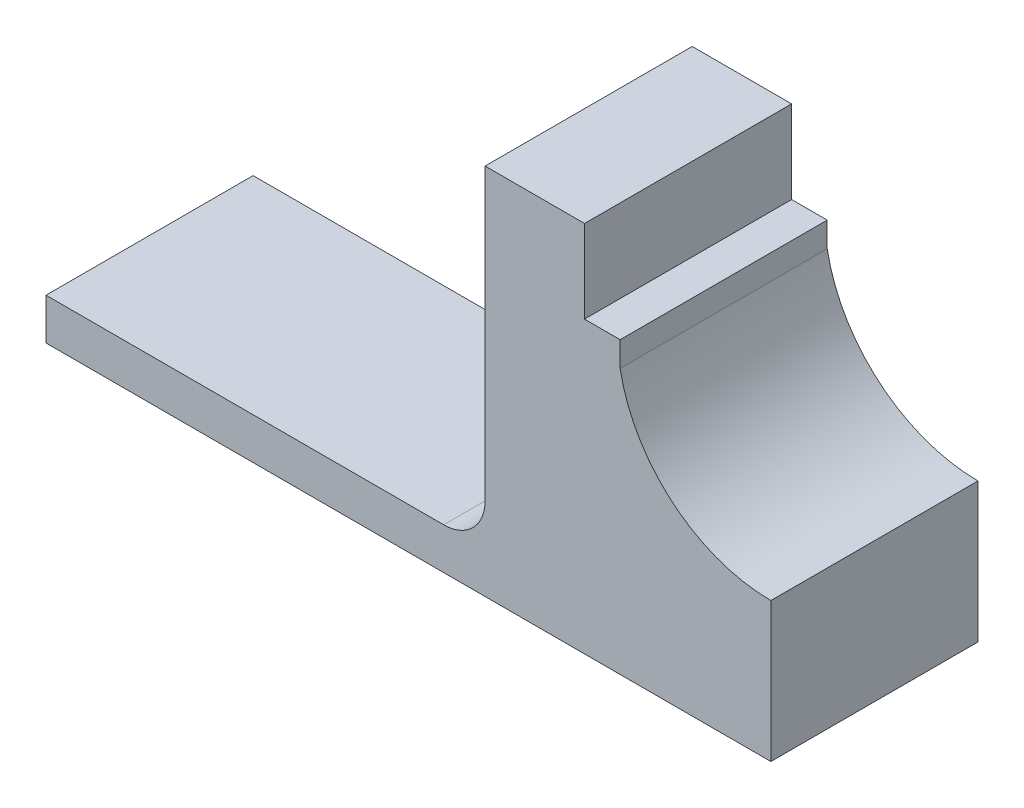
ISO-10303-21;
HEADER;
FILE_DESCRIPTION(('STEP AP214'),'2;1');
FILE_NAME('part.step','',(''),(''),'','','');
FILE_SCHEMA(('AUTOMOTIVE_DESIGN { 1 0 10303 214 1 1 1 1 }'));
ENDSEC;
DATA;
#1=APPLICATION_CONTEXT('core data for automotive mechanical design processes');
#2=APPLICATION_PROTOCOL_DEFINITION('international standard','automotive_design',2000,#1);
#3=PRODUCT_CONTEXT('',#1,'mechanical');
#4=PRODUCT('Part','Part','',(#3));
#5=PRODUCT_RELATED_PRODUCT_CATEGORY('part','',(#4));
#6=PRODUCT_DEFINITION_FORMATION('','',#4);
#7=PRODUCT_DEFINITION_CONTEXT('part definition',#1,'design');
#8=PRODUCT_DEFINITION('design','',#6,#7);
#9=PRODUCT_DEFINITION_SHAPE('','',#8);
#10=(LENGTH_UNIT() NAMED_UNIT(*) SI_UNIT(.MILLI.,.METRE.));
#11=(NAMED_UNIT(*) PLANE_ANGLE_UNIT() SI_UNIT($,.RADIAN.));
#12=(NAMED_UNIT(*) SI_UNIT($,.STERADIAN.) SOLID_ANGLE_UNIT());
#13=UNCERTAINTY_MEASURE_WITH_UNIT(LENGTH_MEASURE(1.E-05),#10,'distance_accuracy_value','');
#14=(GEOMETRIC_REPRESENTATION_CONTEXT(3) GLOBAL_UNCERTAINTY_ASSIGNED_CONTEXT((#13)) GLOBAL_UNIT_ASSIGNED_CONTEXT((#10,
#11,#12)) REPRESENTATION_CONTEXT('',''));
#15=CARTESIAN_POINT('',(0.,0.,0.));
#16=DIRECTION('',(0.,0.,1.));
#17=DIRECTION('',(1.,0.,0.));
#18=AXIS2_PLACEMENT_3D('',#15,#16,#17);
#19=CARTESIAN_POINT('',(-428.150553924179,246.136771999621,635.));
#20=DIRECTION('',(-1.,0.,0.));
#21=DIRECTION('',(0.,-1.,0.));
#22=AXIS2_PLACEMENT_3D('',#19,#20,#21);
#23=PLANE('',#22);
#24=DIRECTION('',(0.,1.,0.));
#25=VECTOR('',#24,1.);
#26=CARTESIAN_POINT('',(-428.150553924179,246.136771999621,0.));
#27=LINE('',#26,#25);
#28=CARTESIAN_POINT('',(-428.150553924179,-7.86322800037897,0.));
#29=VERTEX_POINT('',#28);
#30=CARTESIAN_POINT('',(-428.150553924179,246.136771999621,0.));
#31=VERTEX_POINT('',#30);
#32=EDGE_CURVE('E148',#29,#31,#27,.T.);
#33=ORIENTED_EDGE('',*,*,#32,.T.);
#34=DIRECTION('',(0.,0.,-1.));
#35=VECTOR('',#34,1.);
#36=CARTESIAN_POINT('',(-428.150553924179,246.136771999621,635.));
#37=LINE('',#36,#35);
#38=CARTESIAN_POINT('',(-428.150553924179,246.136771999621,635.));
#39=VERTEX_POINT('',#38);
#40=EDGE_CURVE('E11',#39,#31,#37,.T.);
#41=ORIENTED_EDGE('',*,*,#40,.F.);
#42=DIRECTION('',(0.,1.,0.));
#43=VECTOR('',#42,1.);
#44=CARTESIAN_POINT('',(-428.150553924179,246.136771999621,635.));
#45=LINE('',#44,#43);
#46=CARTESIAN_POINT('',(-428.150553924179,-7.86322800037897,635.));
#47=VERTEX_POINT('',#46);
#48=EDGE_CURVE('E169',#47,#39,#45,.T.);
#49=ORIENTED_EDGE('',*,*,#48,.F.);
#50=DIRECTION('',(0.,0.,-1.));
#51=VECTOR('',#50,1.);
#52=CARTESIAN_POINT('',(-428.150553924179,-7.86322800037897,635.));
#53=LINE('',#52,#51);
#54=EDGE_CURVE('E144',#47,#29,#53,.T.);
#55=ORIENTED_EDGE('',*,*,#54,.T.);
#56=EDGE_LOOP('',(#33,#41,#49,#55));
#57=FACE_BOUND('',#56,.T.);
#58=ADVANCED_FACE('F33',(#57),#23,.F.);
#59=CARTESIAN_POINT('',(-733.012661728365,246.136771999621,635.));
#60=DIRECTION('',(0.,-1.,0.));
#61=DIRECTION('',(0.,0.,-1.));
#62=AXIS2_PLACEMENT_3D('',#59,#60,#61);
#63=PLANE('',#62);
#64=DIRECTION('',(-1.,0.,0.));
#65=VECTOR('',#64,1.);
#66=CARTESIAN_POINT('',(-733.012661728365,246.136771999621,0.));
#67=LINE('',#66,#65);
#68=CARTESIAN_POINT('',(-733.012661728365,246.136771999621,0.));
#69=VERTEX_POINT('',#68);
#70=EDGE_CURVE('E151',#31,#69,#67,.T.);
#71=ORIENTED_EDGE('',*,*,#70,.T.);
#72=DIRECTION('',(0.,0.,-1.));
#73=VECTOR('',#72,1.);
#74=CARTESIAN_POINT('',(-733.012661728365,246.136771999621,635.));
#75=LINE('',#74,#73);
#76=CARTESIAN_POINT('',(-733.012661728365,246.136771999621,635.));
#77=VERTEX_POINT('',#76);
#78=EDGE_CURVE('E41',#77,#69,#75,.T.);
#79=ORIENTED_EDGE('',*,*,#78,.F.);
#80=DIRECTION('',(-1.,0.,0.));
#81=VECTOR('',#80,1.);
#82=CARTESIAN_POINT('',(-733.012661728365,246.136771999621,635.));
#83=LINE('',#82,#81);
#84=EDGE_CURVE('E99',#39,#77,#83,.T.);
#85=ORIENTED_EDGE('',*,*,#84,.F.);
#86=ORIENTED_EDGE('',*,*,#40,.T.);
#87=EDGE_LOOP('',(#71,#79,#85,#86));
#88=FACE_BOUND('',#87,.T.);
#89=ADVANCED_FACE('F231',(#88),#63,.F.);
#90=CARTESIAN_POINT('',(-733.012661728365,-642.863228000378,635.));
#91=DIRECTION('',(1.,0.,0.));
#92=DIRECTION('',(0.,0.,-1.));
#93=AXIS2_PLACEMENT_3D('',#90,#91,#92);
#94=PLANE('',#93);
#95=DIRECTION('',(0.,-1.,0.));
#96=VECTOR('',#95,1.);
#97=CARTESIAN_POINT('',(-733.012661728365,-642.863228000378,0.));
#98=LINE('',#97,#96);
#99=CARTESIAN_POINT('',(-733.012661728365,-642.863228000378,0.));
#100=VERTEX_POINT('',#99);
#101=EDGE_CURVE('E153',#69,#100,#98,.T.);
#102=ORIENTED_EDGE('',*,*,#101,.T.);
#103=DIRECTION('',(0.,0.,-1.));
#104=VECTOR('',#103,1.);
#105=CARTESIAN_POINT('',(-733.012661728365,-642.863228000378,635.));
#106=LINE('',#105,#104);
#107=CARTESIAN_POINT('',(-733.012661728365,-642.863228000378,635.));
#108=VERTEX_POINT('',#107);
#109=EDGE_CURVE('E185',#108,#100,#106,.T.);
#110=ORIENTED_EDGE('',*,*,#109,.F.);
#111=DIRECTION('',(0.,-1.,0.));
#112=VECTOR('',#111,1.);
#113=CARTESIAN_POINT('',(-733.012661728365,-642.863228000378,635.));
#114=LINE('',#113,#112);
#115=EDGE_CURVE('E193',#77,#108,#114,.T.);
#116=ORIENTED_EDGE('',*,*,#115,.F.);
#117=ORIENTED_EDGE('',*,*,#78,.T.);
#118=EDGE_LOOP('',(#102,#110,#116,#117));
#119=FACE_BOUND('',#118,.T.);
#120=ADVANCED_FACE('F191',(#119),#94,.F.);
#121=CARTESIAN_POINT('',(-860.012661728365,-642.863228000379,635.));
#122=DIRECTION('',(0.,0.,-1.));
#123=DIRECTION('',(-1.,0.,0.));
#124=AXIS2_PLACEMENT_3D('',#121,#122,#123);
#125=CYLINDRICAL_SURFACE('',#124,127.);
#126=CARTESIAN_POINT('',(-860.012661728365,-642.863228000379,0.));
#127=DIRECTION('',(0.,0.,-1.));
#128=DIRECTION('',(1.,0.,0.));
#129=AXIS2_PLACEMENT_3D('',#126,#127,#128);
#130=CIRCLE('',#129,127.);
#131=CARTESIAN_POINT('',(-860.012661728366,-769.863228000379,0.));
#132=VERTEX_POINT('',#131);
#133=EDGE_CURVE('E155',#100,#132,#130,.T.);
#134=ORIENTED_EDGE('',*,*,#133,.T.);
#135=DIRECTION('',(0.,0.,-1.));
#136=VECTOR('',#135,1.);
#137=CARTESIAN_POINT('',(-860.012661728366,-769.863228000379,635.));
#138=LINE('',#137,#136);
#139=CARTESIAN_POINT('',(-860.012661728366,-769.863228000379,635.));
#140=VERTEX_POINT('',#139);
#141=EDGE_CURVE('E182',#140,#132,#138,.T.);
#142=ORIENTED_EDGE('',*,*,#141,.F.);
#143=CARTESIAN_POINT('',(-860.012661728365,-642.863228000379,635.));
#144=DIRECTION('',(0.,0.,-1.));
#145=DIRECTION('',(1.,0.,0.));
#146=AXIS2_PLACEMENT_3D('',#143,#144,#145);
#147=CIRCLE('',#146,127.);
#148=EDGE_CURVE('E209',#108,#140,#147,.T.);
#149=ORIENTED_EDGE('',*,*,#148,.F.);
#150=ORIENTED_EDGE('',*,*,#109,.T.);
#151=EDGE_LOOP('',(#134,#142,#149,#150));
#152=FACE_BOUND('',#151,.T.);
#153=ADVANCED_FACE('F200',(#152),#125,.F.);
#154=CARTESIAN_POINT('',(-2079.21266172837,-769.863228000379,635.));
#155=DIRECTION('',(0.,-1.,0.));
#156=DIRECTION('',(0.,0.,-1.));
#157=AXIS2_PLACEMENT_3D('',#154,#155,#156);
#158=PLANE('',#157);
#159=DIRECTION('',(-1.,0.,0.));
#160=VECTOR('',#159,1.);
#161=CARTESIAN_POINT('',(-2079.21266172837,-769.863228000379,0.));
#162=LINE('',#161,#160);
#163=CARTESIAN_POINT('',(-2079.21266172837,-769.863228000379,0.));
#164=VERTEX_POINT('',#163);
#165=EDGE_CURVE('E157',#132,#164,#162,.T.);
#166=ORIENTED_EDGE('',*,*,#165,.T.);
#167=DIRECTION('',(0.,0.,-1.));
#168=VECTOR('',#167,1.);
#169=CARTESIAN_POINT('',(-2079.21266172837,-769.863228000379,635.));
#170=LINE('',#169,#168);
#171=CARTESIAN_POINT('',(-2079.21266172837,-769.863228000379,635.));
#172=VERTEX_POINT('',#171);
#173=EDGE_CURVE('E179',#172,#164,#170,.T.);
#174=ORIENTED_EDGE('',*,*,#173,.F.);
#175=DIRECTION('',(-1.,0.,0.));
#176=VECTOR('',#175,1.);
#177=CARTESIAN_POINT('',(-2079.21266172837,-769.863228000379,635.));
#178=LINE('',#177,#176);
#179=EDGE_CURVE('E206',#140,#172,#178,.T.);
#180=ORIENTED_EDGE('',*,*,#179,.F.);
#181=ORIENTED_EDGE('',*,*,#141,.T.);
#182=EDGE_LOOP('',(#166,#174,#180,#181));
#183=FACE_BOUND('',#182,.T.);
#184=ADVANCED_FACE('F204',(#183),#158,.F.);
#185=CARTESIAN_POINT('',(-2079.21266172837,-769.863228000379,635.));
#186=DIRECTION('',(1.,0.,0.));
#187=DIRECTION('',(0.,0.,-1.));
#188=AXIS2_PLACEMENT_3D('',#185,#186,#187);
#189=PLANE('',#188);
#190=DIRECTION('',(0.,-1.,0.));
#191=VECTOR('',#190,1.);
#192=CARTESIAN_POINT('',(-2079.21266172837,-769.863228000379,0.));
#193=LINE('',#192,#191);
#194=CARTESIAN_POINT('',(-2079.21266172837,-896.863228000379,0.));
#195=VERTEX_POINT('',#194);
#196=EDGE_CURVE('E159',#164,#195,#193,.T.);
#197=ORIENTED_EDGE('',*,*,#196,.T.);
#198=DIRECTION('',(0.,0.,-1.));
#199=VECTOR('',#198,1.);
#200=CARTESIAN_POINT('',(-2079.21266172837,-896.863228000379,635.));
#201=LINE('',#200,#199);
#202=CARTESIAN_POINT('',(-2079.21266172837,-896.863228000379,635.));
#203=VERTEX_POINT('',#202);
#204=EDGE_CURVE('E176',#203,#195,#201,.T.);
#205=ORIENTED_EDGE('',*,*,#204,.F.);
#206=DIRECTION('',(0.,-1.,0.));
#207=VECTOR('',#206,1.);
#208=CARTESIAN_POINT('',(-2079.21266172837,-769.863228000379,635.));
#209=LINE('',#208,#207);
#210=EDGE_CURVE('E208',#172,#203,#209,.T.);
#211=ORIENTED_EDGE('',*,*,#210,.F.);
#212=ORIENTED_EDGE('',*,*,#173,.T.);
#213=EDGE_LOOP('',(#197,#205,#211,#212));
#214=FACE_BOUND('',#213,.T.);
#215=ADVANCED_FACE('F243',(#214),#189,.F.);
#216=CARTESIAN_POINT('',(-2079.21266172837,-896.863228000379,635.));
#217=DIRECTION('',(0.,1.,0.));
#218=DIRECTION('',(0.,0.,1.));
#219=AXIS2_PLACEMENT_3D('',#216,#217,#218);
#220=PLANE('',#219);
#221=DIRECTION('',(1.,0.,0.));
#222=VECTOR('',#221,1.);
#223=CARTESIAN_POINT('',(-2079.21266172837,-896.863228000379,0.));
#224=LINE('',#223,#222);
#225=CARTESIAN_POINT('',(143.287338271635,-896.863228000379,0.));
#226=VERTEX_POINT('',#225);
#227=EDGE_CURVE('E161',#195,#226,#224,.T.);
#228=ORIENTED_EDGE('',*,*,#227,.T.);
#229=DIRECTION('',(0.,0.,-1.));
#230=VECTOR('',#229,1.);
#231=CARTESIAN_POINT('',(143.287338271635,-896.863228000379,635.));
#232=LINE('',#231,#230);
#233=CARTESIAN_POINT('',(143.287338271635,-896.863228000379,635.));
#234=VERTEX_POINT('',#233);
#235=EDGE_CURVE('E173',#234,#226,#232,.T.);
#236=ORIENTED_EDGE('',*,*,#235,.F.);
#237=DIRECTION('',(1.,0.,0.));
#238=VECTOR('',#237,1.);
#239=CARTESIAN_POINT('',(-2079.21266172837,-896.863228000379,635.));
#240=LINE('',#239,#238);
#241=EDGE_CURVE('E211',#203,#234,#240,.T.);
#242=ORIENTED_EDGE('',*,*,#241,.F.);
#243=ORIENTED_EDGE('',*,*,#204,.T.);
#244=EDGE_LOOP('',(#228,#236,#242,#243));
#245=FACE_BOUND('',#244,.T.);
#246=ADVANCED_FACE('F220',(#245),#220,.F.);
#247=CARTESIAN_POINT('',(143.287338271635,-469.337946829636,635.));
#248=DIRECTION('',(-1.,0.,0.));
#249=DIRECTION('',(0.,-1.,0.));
#250=AXIS2_PLACEMENT_3D('',#247,#248,#249);
#251=PLANE('',#250);
#252=DIRECTION('',(0.,1.,0.));
#253=VECTOR('',#252,1.);
#254=CARTESIAN_POINT('',(143.287338271635,-469.337946829636,0.));
#255=LINE('',#254,#253);
#256=CARTESIAN_POINT('',(143.287338271635,-469.337946829636,0.));
#257=VERTEX_POINT('',#256);
#258=EDGE_CURVE('E163',#226,#257,#255,.T.);
#259=ORIENTED_EDGE('',*,*,#258,.T.);
#260=DIRECTION('',(0.,0.,-1.));
#261=VECTOR('',#260,1.);
#262=CARTESIAN_POINT('',(143.287338271635,-469.337946829636,635.));
#263=LINE('',#262,#261);
#264=CARTESIAN_POINT('',(143.287338271635,-469.337946829636,635.));
#265=VERTEX_POINT('',#264);
#266=EDGE_CURVE('E139',#265,#257,#263,.T.);
#267=ORIENTED_EDGE('',*,*,#266,.F.);
#268=DIRECTION('',(0.,1.,0.));
#269=VECTOR('',#268,1.);
#270=CARTESIAN_POINT('',(143.287338271635,-469.337946829636,635.));
#271=LINE('',#270,#269);
#272=EDGE_CURVE('E128',#234,#265,#271,.T.);
#273=ORIENTED_EDGE('',*,*,#272,.F.);
#274=ORIENTED_EDGE('',*,*,#235,.T.);
#275=EDGE_LOOP('',(#259,#267,#273,#274));
#276=FACE_BOUND('',#275,.T.);
#277=ADVANCED_FACE('F224',(#276),#251,.F.);
#278=CARTESIAN_POINT('',(143.287338271634,0.562053170364313,635.));
#279=DIRECTION('',(0.,0.,-1.));
#280=DIRECTION('',(-1.,0.,0.));
#281=AXIS2_PLACEMENT_3D('',#278,#279,#280);
#282=CYLINDRICAL_SURFACE('',#281,469.9);
#283=CARTESIAN_POINT('',(143.287338271634,0.562053170364313,0.));
#284=DIRECTION('',(0.,0.,-1.));
#285=DIRECTION('',(1.,0.,0.));
#286=AXIS2_PLACEMENT_3D('',#283,#284,#285);
#287=CIRCLE('',#286,469.9);
#288=CARTESIAN_POINT('',(-318.929679791064,-84.0632280003788,0.));
#289=VERTEX_POINT('',#288);
#290=EDGE_CURVE('E137',#257,#289,#287,.T.);
#291=ORIENTED_EDGE('',*,*,#290,.T.);
#292=DIRECTION('',(0.,0.,-1.));
#293=VECTOR('',#292,1.);
#294=CARTESIAN_POINT('',(-318.929679791064,-84.0632280003788,635.));
#295=LINE('',#294,#293);
#296=CARTESIAN_POINT('',(-318.929679791064,-84.0632280003788,635.));
#297=VERTEX_POINT('',#296);
#298=EDGE_CURVE('E134',#297,#289,#295,.T.);
#299=ORIENTED_EDGE('',*,*,#298,.F.);
#300=CARTESIAN_POINT('',(143.287338271634,0.562053170364313,635.));
#301=DIRECTION('',(0.,0.,-1.));
#302=DIRECTION('',(1.,0.,0.));
#303=AXIS2_PLACEMENT_3D('',#300,#301,#302);
#304=CIRCLE('',#303,469.9);
#305=EDGE_CURVE('E121',#265,#297,#304,.T.);
#306=ORIENTED_EDGE('',*,*,#305,.F.);
#307=ORIENTED_EDGE('',*,*,#266,.T.);
#308=EDGE_LOOP('',(#291,#299,#306,#307));
#309=FACE_BOUND('',#308,.T.);
#310=ADVANCED_FACE('F135',(#309),#282,.F.);
#311=CARTESIAN_POINT('',(-318.929679791064,-84.063228000379,635.));
#312=DIRECTION('',(-1.,0.,0.));
#313=DIRECTION('',(0.,0.,1.));
#314=AXIS2_PLACEMENT_3D('',#311,#312,#313);
#315=PLANE('',#314);
#316=DIRECTION('',(0.,1.,0.));
#317=VECTOR('',#316,1.);
#318=CARTESIAN_POINT('',(-318.929679791064,-84.063228000379,0.));
#319=LINE('',#318,#317);
#320=CARTESIAN_POINT('',(-318.929679791064,-7.86322800038226,0.));
#321=VERTEX_POINT('',#320);
#322=EDGE_CURVE('E166',#289,#321,#319,.T.);
#323=ORIENTED_EDGE('',*,*,#322,.T.);
#324=DIRECTION('',(0.,0.,-1.));
#325=VECTOR('',#324,1.);
#326=CARTESIAN_POINT('',(-318.929679791064,-7.86322800038226,635.));
#327=LINE('',#326,#325);
#328=CARTESIAN_POINT('',(-318.929679791064,-7.86322800038226,635.));
#329=VERTEX_POINT('',#328);
#330=EDGE_CURVE('E140',#329,#321,#327,.T.);
#331=ORIENTED_EDGE('',*,*,#330,.F.);
#332=DIRECTION('',(0.,1.,0.));
#333=VECTOR('',#332,1.);
#334=CARTESIAN_POINT('',(-318.929679791064,-84.063228000379,635.));
#335=LINE('',#334,#333);
#336=EDGE_CURVE('E125',#297,#329,#335,.T.);
#337=ORIENTED_EDGE('',*,*,#336,.F.);
#338=ORIENTED_EDGE('',*,*,#298,.T.);
#339=EDGE_LOOP('',(#323,#331,#337,#338));
#340=FACE_BOUND('',#339,.T.);
#341=ADVANCED_FACE('F142',(#340),#315,.F.);
#342=CARTESIAN_POINT('',(-428.150553924179,-7.86322800037897,635.));
#343=DIRECTION('',(0.,-1.,0.));
#344=DIRECTION('',(0.,0.,-1.));
#345=AXIS2_PLACEMENT_3D('',#342,#343,#344);
#346=PLANE('',#345);
#347=DIRECTION('',(-1.,0.,0.));
#348=VECTOR('',#347,1.);
#349=CARTESIAN_POINT('',(-428.150553924179,-7.86322800037897,0.));
#350=LINE('',#349,#348);
#351=EDGE_CURVE('E87',#321,#29,#350,.T.);
#352=ORIENTED_EDGE('',*,*,#351,.T.);
#353=ORIENTED_EDGE('',*,*,#54,.F.);
#354=DIRECTION('',(-1.,4.27190489751563E-13,0.));
#355=VECTOR('',#354,1.);
#356=CARTESIAN_POINT('',(-318.929679791064,-7.86322800038226,635.));
#357=LINE('',#356,#355);
#358=EDGE_CURVE('E49',#329,#47,#357,.T.);
#359=ORIENTED_EDGE('',*,*,#358,.F.);
#360=ORIENTED_EDGE('',*,*,#330,.T.);
#361=EDGE_LOOP('',(#352,#353,#359,#360));
#362=FACE_BOUND('',#361,.T.);
#363=ADVANCED_FACE('F225',(#362),#346,.F.);
#364=CARTESIAN_POINT('',(143.287338271634,0.562053170364313,635.));
#365=DIRECTION('',(0.,0.,1.));
#366=DIRECTION('',(1.,0.,0.));
#367=AXIS2_PLACEMENT_3D('',#364,#365,#366);
#368=PLANE('',#367);
#369=ORIENTED_EDGE('',*,*,#48,.T.);
#370=ORIENTED_EDGE('',*,*,#84,.T.);
#371=ORIENTED_EDGE('',*,*,#115,.T.);
#372=ORIENTED_EDGE('',*,*,#148,.T.);
#373=ORIENTED_EDGE('',*,*,#179,.T.);
#374=ORIENTED_EDGE('',*,*,#210,.T.);
#375=ORIENTED_EDGE('',*,*,#241,.T.);
#376=ORIENTED_EDGE('',*,*,#272,.T.);
#377=ORIENTED_EDGE('',*,*,#305,.T.);
#378=ORIENTED_EDGE('',*,*,#336,.T.);
#379=ORIENTED_EDGE('',*,*,#358,.T.);
#380=EDGE_LOOP('',(#369,#370,#371,#372,#373,#374,#375,#376,#377,#378,#379));
#381=FACE_BOUND('',#380,.T.);
#382=ADVANCED_FACE('F123',(#381),#368,.T.);
#383=CARTESIAN_POINT('',(143.287338271634,0.562053170364313,0.));
#384=DIRECTION('',(0.,0.,1.));
#385=DIRECTION('',(1.,0.,0.));
#386=AXIS2_PLACEMENT_3D('',#383,#384,#385);
#387=PLANE('',#386);
#388=ORIENTED_EDGE('',*,*,#32,.F.);
#389=ORIENTED_EDGE('',*,*,#351,.F.);
#390=ORIENTED_EDGE('',*,*,#322,.F.);
#391=ORIENTED_EDGE('',*,*,#290,.F.);
#392=ORIENTED_EDGE('',*,*,#258,.F.);
#393=ORIENTED_EDGE('',*,*,#227,.F.);
#394=ORIENTED_EDGE('',*,*,#196,.F.);
#395=ORIENTED_EDGE('',*,*,#165,.F.);
#396=ORIENTED_EDGE('',*,*,#133,.F.);
#397=ORIENTED_EDGE('',*,*,#101,.F.);
#398=ORIENTED_EDGE('',*,*,#70,.F.);
#399=EDGE_LOOP('',(#388,#389,#390,#391,#392,#393,#394,#395,#396,#397,#398));
#400=FACE_BOUND('',#399,.T.);
#401=ADVANCED_FACE('F195',(#400),#387,.F.);
#402=CLOSED_SHELL('',(#58,#89,#120,#153,#184,#215,#246,#277,#310,#341,#363,#382,#401));
#403=MANIFOLD_SOLID_BREP('B2',#402);
#404=ADVANCED_BREP_SHAPE_REPRESENTATION('',(#18,#403),#14);
#405=SHAPE_DEFINITION_REPRESENTATION(#9,#404);
ENDSEC;
END-ISO-10303-21;
